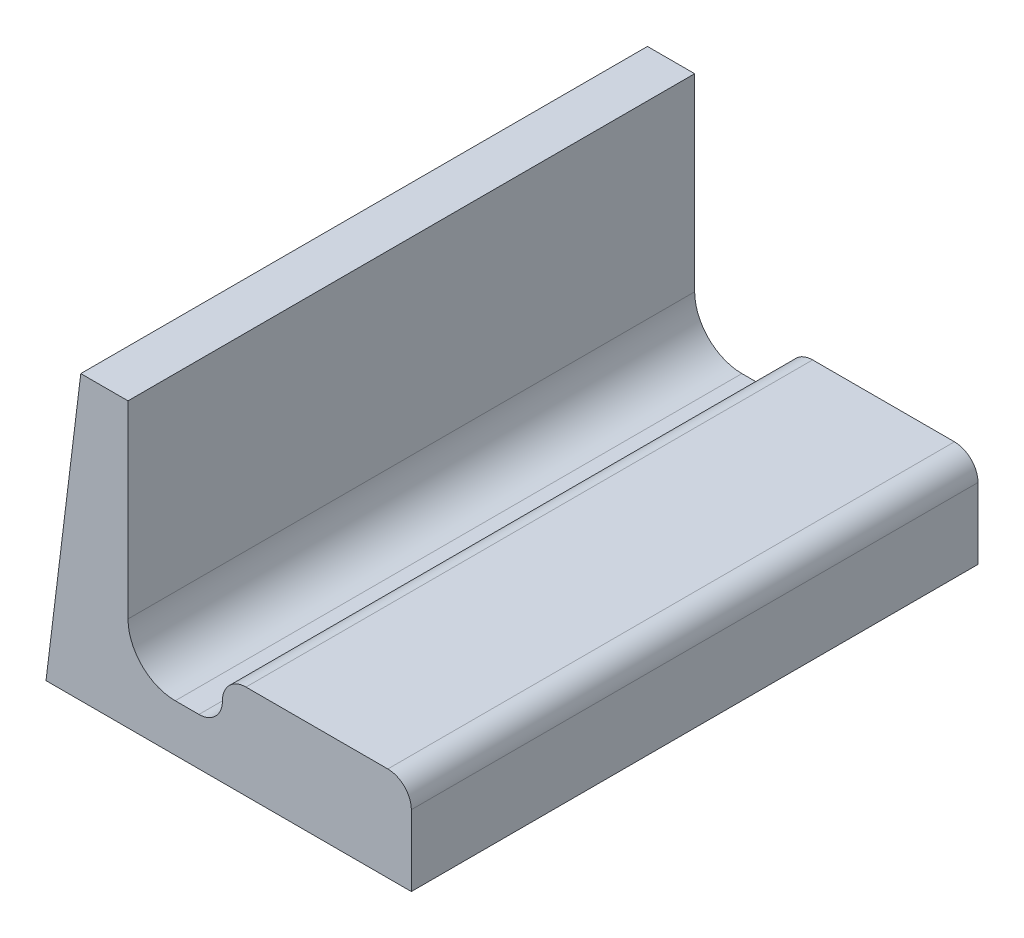
ISO-10303-21;
HEADER;
FILE_DESCRIPTION(('STEP AP214'),'2;1');
FILE_NAME('part.step','',(''),(''),'','','');
FILE_SCHEMA(('AUTOMOTIVE_DESIGN { 1 0 10303 214 1 1 1 1 }'));
ENDSEC;
DATA;
#1=APPLICATION_CONTEXT('core data for automotive mechanical design processes');
#2=APPLICATION_PROTOCOL_DEFINITION('international standard','automotive_design',2000,#1);
#3=PRODUCT_CONTEXT('',#1,'mechanical');
#4=PRODUCT('Part','Part','',(#3));
#5=PRODUCT_RELATED_PRODUCT_CATEGORY('part','',(#4));
#6=PRODUCT_DEFINITION_FORMATION('','',#4);
#7=PRODUCT_DEFINITION_CONTEXT('part definition',#1,'design');
#8=PRODUCT_DEFINITION('design','',#6,#7);
#9=PRODUCT_DEFINITION_SHAPE('','',#8);
#10=(LENGTH_UNIT() NAMED_UNIT(*) SI_UNIT(.MILLI.,.METRE.));
#11=(NAMED_UNIT(*) PLANE_ANGLE_UNIT() SI_UNIT($,.RADIAN.));
#12=(NAMED_UNIT(*) SI_UNIT($,.STERADIAN.) SOLID_ANGLE_UNIT());
#13=UNCERTAINTY_MEASURE_WITH_UNIT(LENGTH_MEASURE(1.E-05),#10,'distance_accuracy_value','');
#14=(GEOMETRIC_REPRESENTATION_CONTEXT(3) GLOBAL_UNCERTAINTY_ASSIGNED_CONTEXT((#13)) GLOBAL_UNIT_ASSIGNED_CONTEXT((#10,
#11,#12)) REPRESENTATION_CONTEXT('',''));
#15=CARTESIAN_POINT('',(0.,0.,0.));
#16=DIRECTION('',(0.,0.,1.));
#17=DIRECTION('',(1.,0.,0.));
#18=AXIS2_PLACEMENT_3D('',#15,#16,#17);
#19=CARTESIAN_POINT('',(9.3561835408008,76.2,152.4));
#20=DIRECTION('',(0.992546151641323,-0.121869343405141,0.));
#21=DIRECTION('',(0.121869343405141,0.992546151641323,0.));
#22=AXIS2_PLACEMENT_3D('',#19,#20,#21);
#23=PLANE('',#22);
#24=DIRECTION('',(-0.121869343405141,-0.992546151641323,0.));
#25=VECTOR('',#24,1.);
#26=CARTESIAN_POINT('',(9.3561835408008,76.2,0.));
#27=LINE('',#26,#25);
#28=CARTESIAN_POINT('',(9.3561835408008,76.2,0.));
#29=VERTEX_POINT('',#28);
#30=CARTESIAN_POINT('',(0.,0.,0.));
#31=VERTEX_POINT('',#30);
#32=EDGE_CURVE('E153',#29,#31,#27,.T.);
#33=ORIENTED_EDGE('',*,*,#32,.T.);
#34=DIRECTION('',(0.,0.,-1.));
#35=VECTOR('',#34,1.);
#36=CARTESIAN_POINT('',(0.,0.,152.4));
#37=LINE('',#36,#35);
#38=CARTESIAN_POINT('',(0.,0.,152.4));
#39=VERTEX_POINT('',#38);
#40=EDGE_CURVE('E11',#39,#31,#37,.T.);
#41=ORIENTED_EDGE('',*,*,#40,.F.);
#42=DIRECTION('',(-0.121869343405141,-0.992546151641323,0.));
#43=VECTOR('',#42,1.);
#44=CARTESIAN_POINT('',(9.3561835408008,76.2,152.4));
#45=LINE('',#44,#43);
#46=CARTESIAN_POINT('',(9.3561835408008,76.2,152.4));
#47=VERTEX_POINT('',#46);
#48=EDGE_CURVE('E176',#47,#39,#45,.T.);
#49=ORIENTED_EDGE('',*,*,#48,.F.);
#50=DIRECTION('',(0.,0.,-1.));
#51=VECTOR('',#50,1.);
#52=CARTESIAN_POINT('',(9.3561835408008,76.2,152.4));
#53=LINE('',#52,#51);
#54=EDGE_CURVE('E149',#47,#29,#53,.T.);
#55=ORIENTED_EDGE('',*,*,#54,.T.);
#56=EDGE_LOOP('',(#33,#41,#49,#55));
#57=FACE_BOUND('',#56,.T.);
#58=ADVANCED_FACE('F33',(#57),#23,.F.);
#59=CARTESIAN_POINT('',(0.,0.,152.4));
#60=DIRECTION('',(0.,1.,0.));
#61=DIRECTION('',(0.,0.,1.));
#62=AXIS2_PLACEMENT_3D('',#59,#60,#61);
#63=PLANE('',#62);
#64=DIRECTION('',(1.,0.,0.));
#65=VECTOR('',#64,1.);
#66=CARTESIAN_POINT('',(0.,0.,0.));
#67=LINE('',#66,#65);
#68=CARTESIAN_POINT('',(98.2561835408008,0.,0.));
#69=VERTEX_POINT('',#68);
#70=EDGE_CURVE('E156',#31,#69,#67,.T.);
#71=ORIENTED_EDGE('',*,*,#70,.T.);
#72=DIRECTION('',(0.,0.,-1.));
#73=VECTOR('',#72,1.);
#74=CARTESIAN_POINT('',(98.2561835408008,0.,152.4));
#75=LINE('',#74,#73);
#76=CARTESIAN_POINT('',(98.2561835408008,0.,152.4));
#77=VERTEX_POINT('',#76);
#78=EDGE_CURVE('E41',#77,#69,#75,.T.);
#79=ORIENTED_EDGE('',*,*,#78,.F.);
#80=DIRECTION('',(1.,0.,0.));
#81=VECTOR('',#80,1.);
#82=CARTESIAN_POINT('',(0.,0.,152.4));
#83=LINE('',#82,#81);
#84=EDGE_CURVE('E104',#39,#77,#83,.T.);
#85=ORIENTED_EDGE('',*,*,#84,.F.);
#86=ORIENTED_EDGE('',*,*,#40,.T.);
#87=EDGE_LOOP('',(#71,#79,#85,#86));
#88=FACE_BOUND('',#87,.T.);
#89=ADVANCED_FACE('F203',(#88),#63,.F.);
#90=CARTESIAN_POINT('',(98.2561835408008,19.0754,152.4));
#91=DIRECTION('',(-1.,0.,0.));
#92=DIRECTION('',(0.,-1.,0.));
#93=AXIS2_PLACEMENT_3D('',#90,#91,#92);
#94=PLANE('',#93);
#95=DIRECTION('',(0.,1.,0.));
#96=VECTOR('',#95,1.);
#97=CARTESIAN_POINT('',(98.2561835408008,19.0754,0.));
#98=LINE('',#97,#96);
#99=CARTESIAN_POINT('',(98.2561835408008,19.0754,0.));
#100=VERTEX_POINT('',#99);
#101=EDGE_CURVE('E159',#69,#100,#98,.T.);
#102=ORIENTED_EDGE('',*,*,#101,.T.);
#103=DIRECTION('',(0.,0.,-1.));
#104=VECTOR('',#103,1.);
#105=CARTESIAN_POINT('',(98.2561835408008,19.0754,152.4));
#106=LINE('',#105,#104);
#107=CARTESIAN_POINT('',(98.2561835408008,19.0754,152.4));
#108=VERTEX_POINT('',#107);
#109=EDGE_CURVE('E195',#108,#100,#106,.T.);
#110=ORIENTED_EDGE('',*,*,#109,.F.);
#111=DIRECTION('',(0.,1.,0.));
#112=VECTOR('',#111,1.);
#113=CARTESIAN_POINT('',(98.2561835408008,0.,152.4));
#114=LINE('',#113,#112);
#115=EDGE_CURVE('E202',#77,#108,#114,.T.);
#116=ORIENTED_EDGE('',*,*,#115,.F.);
#117=ORIENTED_EDGE('',*,*,#78,.T.);
#118=EDGE_LOOP('',(#102,#110,#116,#117));
#119=FACE_BOUND('',#118,.T.);
#120=ADVANCED_FACE('F200',(#119),#94,.F.);
#121=CARTESIAN_POINT('',(91.9315835408008,19.0754,152.4));
#122=DIRECTION('',(0.,0.,-1.));
#123=DIRECTION('',(-1.,0.,0.));
#124=AXIS2_PLACEMENT_3D('',#121,#122,#123);
#125=CYLINDRICAL_SURFACE('',#124,6.3246);
#126=CARTESIAN_POINT('',(91.9315835408008,19.0754,0.));
#127=DIRECTION('',(0.,0.,1.));
#128=DIRECTION('',(-1.,0.,0.));
#129=AXIS2_PLACEMENT_3D('',#126,#127,#128);
#130=CIRCLE('',#129,6.3246);
#131=CARTESIAN_POINT('',(91.9315835408008,25.4,0.));
#132=VERTEX_POINT('',#131);
#133=EDGE_CURVE('E161',#100,#132,#130,.T.);
#134=ORIENTED_EDGE('',*,*,#133,.T.);
#135=DIRECTION('',(0.,0.,-1.));
#136=VECTOR('',#135,1.);
#137=CARTESIAN_POINT('',(91.9315835408008,25.4,152.4));
#138=LINE('',#137,#136);
#139=CARTESIAN_POINT('',(91.9315835408008,25.4,152.4));
#140=VERTEX_POINT('',#139);
#141=EDGE_CURVE('E192',#140,#132,#138,.T.);
#142=ORIENTED_EDGE('',*,*,#141,.F.);
#143=CARTESIAN_POINT('',(91.9315835408008,19.0754,152.4));
#144=DIRECTION('',(0.,0.,1.));
#145=DIRECTION('',(-1.,0.,0.));
#146=AXIS2_PLACEMENT_3D('',#143,#144,#145);
#147=CIRCLE('',#146,6.3246);
#148=EDGE_CURVE('E222',#108,#140,#147,.T.);
#149=ORIENTED_EDGE('',*,*,#148,.F.);
#150=ORIENTED_EDGE('',*,*,#109,.T.);
#151=EDGE_LOOP('',(#134,#142,#149,#150));
#152=FACE_BOUND('',#151,.T.);
#153=ADVANCED_FACE('F213',(#152),#125,.T.);
#154=CARTESIAN_POINT('',(53.7807835408008,25.4,152.4));
#155=DIRECTION('',(0.,-1.,0.));
#156=DIRECTION('',(1.,0.,0.));
#157=AXIS2_PLACEMENT_3D('',#154,#155,#156);
#158=PLANE('',#157);
#159=DIRECTION('',(-1.,0.,0.));
#160=VECTOR('',#159,1.);
#161=CARTESIAN_POINT('',(53.7807835408008,25.4,0.));
#162=LINE('',#161,#160);
#163=CARTESIAN_POINT('',(53.7807835408008,25.4,0.));
#164=VERTEX_POINT('',#163);
#165=EDGE_CURVE('E163',#132,#164,#162,.T.);
#166=ORIENTED_EDGE('',*,*,#165,.T.);
#167=DIRECTION('',(0.,0.,-1.));
#168=VECTOR('',#167,1.);
#169=CARTESIAN_POINT('',(53.7807835408008,25.4,152.4));
#170=LINE('',#169,#168);
#171=CARTESIAN_POINT('',(53.7807835408008,25.4,152.4));
#172=VERTEX_POINT('',#171);
#173=EDGE_CURVE('E189',#172,#164,#170,.T.);
#174=ORIENTED_EDGE('',*,*,#173,.F.);
#175=DIRECTION('',(-1.,0.,0.));
#176=VECTOR('',#175,1.);
#177=CARTESIAN_POINT('',(53.7807835408008,25.4,152.4));
#178=LINE('',#177,#176);
#179=EDGE_CURVE('E219',#140,#172,#178,.T.);
#180=ORIENTED_EDGE('',*,*,#179,.F.);
#181=ORIENTED_EDGE('',*,*,#141,.T.);
#182=EDGE_LOOP('',(#166,#174,#180,#181));
#183=FACE_BOUND('',#182,.T.);
#184=ADVANCED_FACE('F217',(#183),#158,.F.);
#185=CARTESIAN_POINT('',(53.7807835408008,19.0754,152.4));
#186=DIRECTION('',(0.,0.,-1.));
#187=DIRECTION('',(-1.,0.,0.));
#188=AXIS2_PLACEMENT_3D('',#185,#186,#187);
#189=CYLINDRICAL_SURFACE('',#188,6.3246);
#190=CARTESIAN_POINT('',(53.7807835408008,19.0754,0.));
#191=DIRECTION('',(0.,0.,1.));
#192=DIRECTION('',(-1.,0.,0.));
#193=AXIS2_PLACEMENT_3D('',#190,#191,#192);
#194=CIRCLE('',#193,6.3246);
#195=CARTESIAN_POINT('',(47.4561835408008,19.0754,0.));
#196=VERTEX_POINT('',#195);
#197=EDGE_CURVE('E165',#164,#196,#194,.T.);
#198=ORIENTED_EDGE('',*,*,#197,.T.);
#199=DIRECTION('',(0.,0.,-1.));
#200=VECTOR('',#199,1.);
#201=CARTESIAN_POINT('',(47.4561835408008,19.0754,152.4));
#202=LINE('',#201,#200);
#203=CARTESIAN_POINT('',(47.4561835408008,19.0754,152.4));
#204=VERTEX_POINT('',#203);
#205=EDGE_CURVE('E186',#204,#196,#202,.T.);
#206=ORIENTED_EDGE('',*,*,#205,.F.);
#207=CARTESIAN_POINT('',(53.7807835408008,19.0754,152.4));
#208=DIRECTION('',(0.,0.,1.));
#209=DIRECTION('',(-1.,0.,0.));
#210=AXIS2_PLACEMENT_3D('',#207,#208,#209);
#211=CIRCLE('',#210,6.3246);
#212=EDGE_CURVE('E221',#172,#204,#211,.T.);
#213=ORIENTED_EDGE('',*,*,#212,.F.);
#214=ORIENTED_EDGE('',*,*,#173,.T.);
#215=EDGE_LOOP('',(#198,#206,#213,#214));
#216=FACE_BOUND('',#215,.T.);
#217=ADVANCED_FACE('F246',(#216),#189,.T.);
#218=CARTESIAN_POINT('',(47.4561835408008,19.0246,152.4));
#219=DIRECTION('',(1.,0.,0.));
#220=DIRECTION('',(0.,0.,-1.));
#221=AXIS2_PLACEMENT_3D('',#218,#219,#220);
#222=PLANE('',#221);
#223=DIRECTION('',(0.,-1.,0.));
#224=VECTOR('',#223,1.);
#225=CARTESIAN_POINT('',(47.4561835408008,19.0246,0.));
#226=LINE('',#225,#224);
#227=CARTESIAN_POINT('',(47.4561835408008,19.0246,0.));
#228=VERTEX_POINT('',#227);
#229=EDGE_CURVE('E167',#196,#228,#226,.T.);
#230=ORIENTED_EDGE('',*,*,#229,.T.);
#231=DIRECTION('',(0.,0.,-1.));
#232=VECTOR('',#231,1.);
#233=CARTESIAN_POINT('',(47.4561835408008,19.0246,152.4));
#234=LINE('',#233,#232);
#235=CARTESIAN_POINT('',(47.4561835408008,19.0246,152.4));
#236=VERTEX_POINT('',#235);
#237=EDGE_CURVE('E183',#236,#228,#234,.T.);
#238=ORIENTED_EDGE('',*,*,#237,.F.);
#239=DIRECTION('',(0.,-1.,0.));
#240=VECTOR('',#239,1.);
#241=CARTESIAN_POINT('',(47.4561835408008,19.0246,152.4));
#242=LINE('',#241,#240);
#243=EDGE_CURVE('E224',#204,#236,#242,.T.);
#244=ORIENTED_EDGE('',*,*,#243,.F.);
#245=ORIENTED_EDGE('',*,*,#205,.T.);
#246=EDGE_LOOP('',(#230,#238,#244,#245));
#247=FACE_BOUND('',#246,.T.);
#248=ADVANCED_FACE('F243',(#247),#222,.F.);
#249=CARTESIAN_POINT('',(41.1315835408008,19.0246,152.4));
#250=DIRECTION('',(0.,0.,-1.));
#251=DIRECTION('',(-1.,0.,0.));
#252=AXIS2_PLACEMENT_3D('',#249,#250,#251);
#253=CYLINDRICAL_SURFACE('',#252,6.3246);
#254=CARTESIAN_POINT('',(41.1315835408008,19.0246,0.));
#255=DIRECTION('',(0.,0.,-1.));
#256=DIRECTION('',(1.,0.,0.));
#257=AXIS2_PLACEMENT_3D('',#254,#255,#256);
#258=CIRCLE('',#257,6.3246);
#259=CARTESIAN_POINT('',(41.1315835408008,12.7,0.));
#260=VERTEX_POINT('',#259);
#261=EDGE_CURVE('E169',#228,#260,#258,.T.);
#262=ORIENTED_EDGE('',*,*,#261,.T.);
#263=DIRECTION('',(0.,0.,-1.));
#264=VECTOR('',#263,1.);
#265=CARTESIAN_POINT('',(41.1315835408008,12.7,152.4));
#266=LINE('',#265,#264);
#267=CARTESIAN_POINT('',(41.1315835408008,12.7,152.4));
#268=VERTEX_POINT('',#267);
#269=EDGE_CURVE('E180',#268,#260,#266,.T.);
#270=ORIENTED_EDGE('',*,*,#269,.F.);
#271=CARTESIAN_POINT('',(41.1315835408008,19.0246,152.4));
#272=DIRECTION('',(0.,0.,-1.));
#273=DIRECTION('',(1.,0.,0.));
#274=AXIS2_PLACEMENT_3D('',#271,#272,#273);
#275=CIRCLE('',#274,6.3246);
#276=EDGE_CURVE('E230',#236,#268,#275,.T.);
#277=ORIENTED_EDGE('',*,*,#276,.F.);
#278=ORIENTED_EDGE('',*,*,#237,.T.);
#279=EDGE_LOOP('',(#262,#270,#277,#278));
#280=FACE_BOUND('',#279,.T.);
#281=ADVANCED_FACE('F236',(#280),#253,.F.);
#282=CARTESIAN_POINT('',(34.7561835408009,12.7,152.4));
#283=DIRECTION('',(0.,-1.,0.));
#284=DIRECTION('',(1.,0.,0.));
#285=AXIS2_PLACEMENT_3D('',#282,#283,#284);
#286=PLANE('',#285);
#287=DIRECTION('',(-1.,0.,0.));
#288=VECTOR('',#287,1.);
#289=CARTESIAN_POINT('',(34.7561835408009,12.7,0.));
#290=LINE('',#289,#288);
#291=CARTESIAN_POINT('',(34.7561835408009,12.7,0.));
#292=VERTEX_POINT('',#291);
#293=EDGE_CURVE('E171',#260,#292,#290,.T.);
#294=ORIENTED_EDGE('',*,*,#293,.T.);
#295=DIRECTION('',(0.,0.,-1.));
#296=VECTOR('',#295,1.);
#297=CARTESIAN_POINT('',(34.7561835408009,12.7,152.4));
#298=LINE('',#297,#296);
#299=CARTESIAN_POINT('',(34.7561835408009,12.7,152.4));
#300=VERTEX_POINT('',#299);
#301=EDGE_CURVE('E144',#300,#292,#298,.T.);
#302=ORIENTED_EDGE('',*,*,#301,.F.);
#303=DIRECTION('',(-1.,0.,0.));
#304=VECTOR('',#303,1.);
#305=CARTESIAN_POINT('',(34.7561835408009,12.7,152.4));
#306=LINE('',#305,#304);
#307=EDGE_CURVE('E135',#268,#300,#306,.T.);
#308=ORIENTED_EDGE('',*,*,#307,.F.);
#309=ORIENTED_EDGE('',*,*,#269,.T.);
#310=EDGE_LOOP('',(#294,#302,#308,#309));
#311=FACE_BOUND('',#310,.T.);
#312=ADVANCED_FACE('F240',(#311),#286,.F.);
#313=CARTESIAN_POINT('',(34.7561835408008,25.4,152.4));
#314=DIRECTION('',(0.,0.,-1.));
#315=DIRECTION('',(-1.,0.,0.));
#316=AXIS2_PLACEMENT_3D('',#313,#314,#315);
#317=CYLINDRICAL_SURFACE('',#316,12.7);
#318=CARTESIAN_POINT('',(34.7561835408008,25.4,0.));
#319=DIRECTION('',(0.,0.,-1.));
#320=DIRECTION('',(-1.,0.,0.));
#321=AXIS2_PLACEMENT_3D('',#318,#319,#320);
#322=CIRCLE('',#321,12.7);
#323=CARTESIAN_POINT('',(22.0561835408008,25.4,0.));
#324=VERTEX_POINT('',#323);
#325=EDGE_CURVE('E143',#292,#324,#322,.T.);
#326=ORIENTED_EDGE('',*,*,#325,.T.);
#327=DIRECTION('',(0.,0.,-1.));
#328=VECTOR('',#327,1.);
#329=CARTESIAN_POINT('',(22.0561835408008,25.4,152.4));
#330=LINE('',#329,#328);
#331=CARTESIAN_POINT('',(22.0561835408008,25.4,152.4));
#332=VERTEX_POINT('',#331);
#333=EDGE_CURVE('E140',#332,#324,#330,.T.);
#334=ORIENTED_EDGE('',*,*,#333,.F.);
#335=CARTESIAN_POINT('',(34.7561835408008,25.4,152.4));
#336=DIRECTION('',(0.,0.,-1.));
#337=DIRECTION('',(-1.,0.,0.));
#338=AXIS2_PLACEMENT_3D('',#335,#336,#337);
#339=CIRCLE('',#338,12.7);
#340=EDGE_CURVE('E129',#300,#332,#339,.T.);
#341=ORIENTED_EDGE('',*,*,#340,.F.);
#342=ORIENTED_EDGE('',*,*,#301,.T.);
#343=EDGE_LOOP('',(#326,#334,#341,#342));
#344=FACE_BOUND('',#343,.T.);
#345=ADVANCED_FACE('F141',(#344),#317,.F.);
#346=CARTESIAN_POINT('',(22.0561835408008,25.4000000000001,152.4));
#347=DIRECTION('',(-1.,0.,0.));
#348=DIRECTION('',(0.,0.,1.));
#349=AXIS2_PLACEMENT_3D('',#346,#347,#348);
#350=PLANE('',#349);
#351=DIRECTION('',(0.,1.,0.));
#352=VECTOR('',#351,1.);
#353=CARTESIAN_POINT('',(22.0561835408008,25.4000000000001,0.));
#354=LINE('',#353,#352);
#355=CARTESIAN_POINT('',(22.0561835408008,76.2,0.));
#356=VERTEX_POINT('',#355);
#357=EDGE_CURVE('E90',#324,#356,#354,.T.);
#358=ORIENTED_EDGE('',*,*,#357,.T.);
#359=DIRECTION('',(0.,0.,-1.));
#360=VECTOR('',#359,1.);
#361=CARTESIAN_POINT('',(22.0561835408008,76.2,152.4));
#362=LINE('',#361,#360);
#363=CARTESIAN_POINT('',(22.0561835408008,76.2,152.4));
#364=VERTEX_POINT('',#363);
#365=EDGE_CURVE('E145',#364,#356,#362,.T.);
#366=ORIENTED_EDGE('',*,*,#365,.F.);
#367=DIRECTION('',(0.,1.,0.));
#368=VECTOR('',#367,1.);
#369=CARTESIAN_POINT('',(22.0561835408008,25.4000000000001,152.4));
#370=LINE('',#369,#368);
#371=EDGE_CURVE('E133',#332,#364,#370,.T.);
#372=ORIENTED_EDGE('',*,*,#371,.F.);
#373=ORIENTED_EDGE('',*,*,#333,.T.);
#374=EDGE_LOOP('',(#358,#366,#372,#373));
#375=FACE_BOUND('',#374,.T.);
#376=ADVANCED_FACE('F147',(#375),#350,.F.);
#377=CARTESIAN_POINT('',(22.0561835408008,76.2,152.4));
#378=DIRECTION('',(0.,-1.,0.));
#379=DIRECTION('',(0.,0.,-1.));
#380=AXIS2_PLACEMENT_3D('',#377,#378,#379);
#381=PLANE('',#380);
#382=DIRECTION('',(-1.,0.,0.));
#383=VECTOR('',#382,1.);
#384=CARTESIAN_POINT('',(22.0561835408008,76.2,0.));
#385=LINE('',#384,#383);
#386=EDGE_CURVE('E96',#356,#29,#385,.T.);
#387=ORIENTED_EDGE('',*,*,#386,.T.);
#388=ORIENTED_EDGE('',*,*,#54,.F.);
#389=DIRECTION('',(-1.,0.,0.));
#390=VECTOR('',#389,1.);
#391=CARTESIAN_POINT('',(22.0561835408008,76.2,152.4));
#392=LINE('',#391,#390);
#393=EDGE_CURVE('E49',#364,#47,#392,.T.);
#394=ORIENTED_EDGE('',*,*,#393,.F.);
#395=ORIENTED_EDGE('',*,*,#365,.T.);
#396=EDGE_LOOP('',(#387,#388,#394,#395));
#397=FACE_BOUND('',#396,.T.);
#398=ADVANCED_FACE('F261',(#397),#381,.F.);
#399=CARTESIAN_POINT('',(91.9315835408008,19.0754,152.4));
#400=DIRECTION('',(0.,0.,-1.));
#401=DIRECTION('',(-1.,0.,0.));
#402=AXIS2_PLACEMENT_3D('',#399,#400,#401);
#403=PLANE('',#402);
#404=ORIENTED_EDGE('',*,*,#48,.T.);
#405=ORIENTED_EDGE('',*,*,#84,.T.);
#406=ORIENTED_EDGE('',*,*,#115,.T.);
#407=ORIENTED_EDGE('',*,*,#148,.T.);
#408=ORIENTED_EDGE('',*,*,#179,.T.);
#409=ORIENTED_EDGE('',*,*,#212,.T.);
#410=ORIENTED_EDGE('',*,*,#243,.T.);
#411=ORIENTED_EDGE('',*,*,#276,.T.);
#412=ORIENTED_EDGE('',*,*,#307,.T.);
#413=ORIENTED_EDGE('',*,*,#340,.T.);
#414=ORIENTED_EDGE('',*,*,#371,.T.);
#415=ORIENTED_EDGE('',*,*,#393,.T.);
#416=EDGE_LOOP('',(#404,#405,#406,#407,#408,#409,#410,#411,#412,#413,#414,#415));
#417=FACE_BOUND('',#416,.T.);
#418=ADVANCED_FACE('F131',(#417),#403,.F.);
#419=CARTESIAN_POINT('',(91.9315835408008,19.0754,0.));
#420=DIRECTION('',(0.,0.,-1.));
#421=DIRECTION('',(-1.,0.,0.));
#422=AXIS2_PLACEMENT_3D('',#419,#420,#421);
#423=PLANE('',#422);
#424=ORIENTED_EDGE('',*,*,#32,.F.);
#425=ORIENTED_EDGE('',*,*,#386,.F.);
#426=ORIENTED_EDGE('',*,*,#357,.F.);
#427=ORIENTED_EDGE('',*,*,#325,.F.);
#428=ORIENTED_EDGE('',*,*,#293,.F.);
#429=ORIENTED_EDGE('',*,*,#261,.F.);
#430=ORIENTED_EDGE('',*,*,#229,.F.);
#431=ORIENTED_EDGE('',*,*,#197,.F.);
#432=ORIENTED_EDGE('',*,*,#165,.F.);
#433=ORIENTED_EDGE('',*,*,#133,.F.);
#434=ORIENTED_EDGE('',*,*,#101,.F.);
#435=ORIENTED_EDGE('',*,*,#70,.F.);
#436=EDGE_LOOP('',(#424,#425,#426,#427,#428,#429,#430,#431,#432,#433,#434,#435));
#437=FACE_BOUND('',#436,.T.);
#438=ADVANCED_FACE('F207',(#437),#423,.T.);
#439=CLOSED_SHELL('',(#58,#89,#120,#153,#184,#217,#248,#281,#312,#345,#376,#398,#418,#438));
#440=MANIFOLD_SOLID_BREP('B2',#439);
#441=ADVANCED_BREP_SHAPE_REPRESENTATION('',(#18,#440),#14);
#442=SHAPE_DEFINITION_REPRESENTATION(#9,#441);
ENDSEC;
END-ISO-10303-21;
